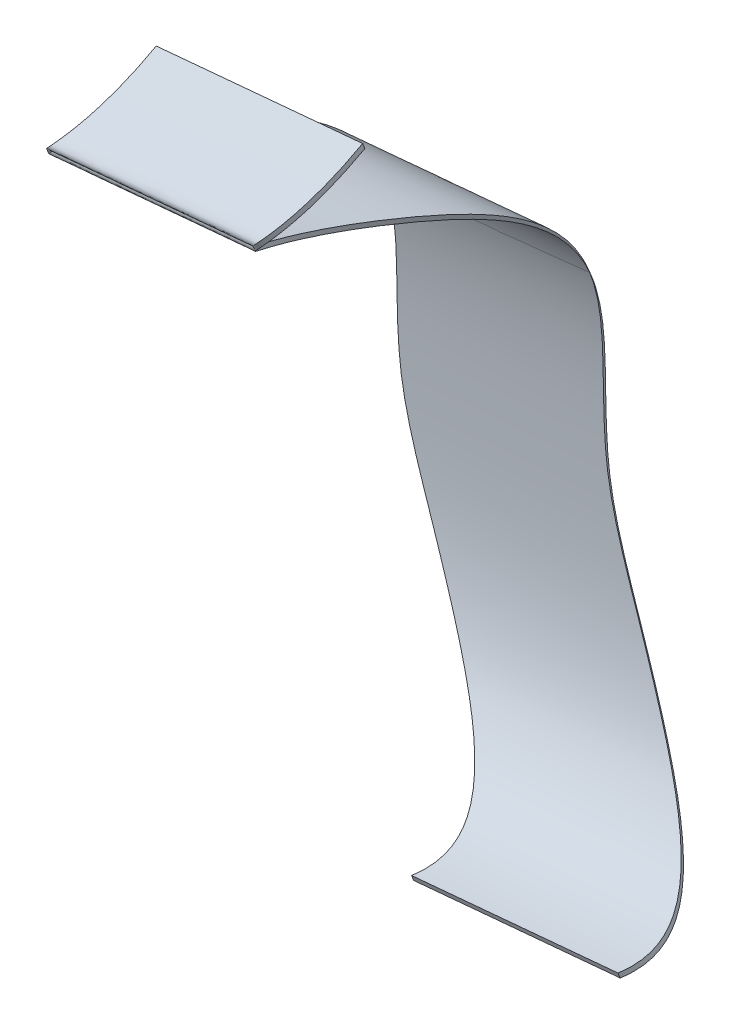
ISO-10303-21;
HEADER;
FILE_DESCRIPTION(('STEP AP214'),'2;1');
FILE_NAME('part.step','',(''),(''),'','','');
FILE_SCHEMA(('AUTOMOTIVE_DESIGN { 1 0 10303 214 1 1 1 1 }'));
ENDSEC;
DATA;
#1=APPLICATION_CONTEXT('core data for automotive mechanical design processes');
#2=APPLICATION_PROTOCOL_DEFINITION('international standard','automotive_design',2000,#1);
#3=PRODUCT_CONTEXT('',#1,'mechanical');
#4=PRODUCT('Part','Part','',(#3));
#5=PRODUCT_RELATED_PRODUCT_CATEGORY('part','',(#4));
#6=PRODUCT_DEFINITION_FORMATION('','',#4);
#7=PRODUCT_DEFINITION_CONTEXT('part definition',#1,'design');
#8=PRODUCT_DEFINITION('design','',#6,#7);
#9=PRODUCT_DEFINITION_SHAPE('','',#8);
#10=(LENGTH_UNIT() NAMED_UNIT(*) SI_UNIT(.MILLI.,.METRE.));
#11=(NAMED_UNIT(*) PLANE_ANGLE_UNIT() SI_UNIT($,.RADIAN.));
#12=(NAMED_UNIT(*) SI_UNIT($,.STERADIAN.) SOLID_ANGLE_UNIT());
#13=UNCERTAINTY_MEASURE_WITH_UNIT(LENGTH_MEASURE(1.E-05),#10,'distance_accuracy_value','');
#14=(GEOMETRIC_REPRESENTATION_CONTEXT(3) GLOBAL_UNCERTAINTY_ASSIGNED_CONTEXT((#13)) GLOBAL_UNIT_ASSIGNED_CONTEXT((#10,
#11,#12)) REPRESENTATION_CONTEXT('',''));
#15=CARTESIAN_POINT('',(0.,0.,0.));
#16=DIRECTION('',(0.,0.,1.));
#17=DIRECTION('',(1.,0.,0.));
#18=AXIS2_PLACEMENT_3D('',#15,#16,#17);
#19=CARTESIAN_POINT('',(0.694134087839004,-3.45576421709549,8.19127936923621));
#20=DIRECTION('',(-0.0778398423535431,0.38752763562898,-0.918565887983104));
#21=DIRECTION('',(0.,0.921361412279013,0.38870702072798));
#22=AXIS2_PLACEMENT_3D('',#19,#20,#21);
#23=PLANE('',#22);
#24=DIRECTION('',(-0.00842247206645635,-0.921584146093297,-0.388087262911035));
#25=VECTOR('',#24,1.);
#26=CARTESIAN_POINT('',(-15.9733367733512,-2.04938041013008,10.1970210583957));
#27=LINE('',#26,#25);
#28=CARTESIAN_POINT('',(-15.9733367733512,-2.04938041013008,10.1970210583957));
#29=VERTEX_POINT('',#28);
#30=CARTESIAN_POINT('',(-15.9775480093844,-2.51017248317673,10.0029774269402));
#31=VERTEX_POINT('',#30);
#32=EDGE_CURVE('E75',#29,#31,#27,.T.);
#33=ORIENTED_EDGE('',*,*,#32,.F.);
#34=DIRECTION('',(-0.996930298920976,-0.0224720558316756,0.0749999053334918));
#35=VECTOR('',#34,1.);
#36=CARTESIAN_POINT('',(-0.0224519906155823,-1.68982751682327,8.99702257305982));
#37=LINE('',#36,#35);
#38=CARTESIAN_POINT('',(-0.0224519906155824,-1.68982751682327,8.99702257305982));
#39=VERTEX_POINT('',#38);
#40=EDGE_CURVE('E78',#39,#29,#37,.T.);
#41=ORIENTED_EDGE('',*,*,#40,.F.);
#42=DIRECTION('',(0.00842247206645636,0.921584146093297,0.388087262911036));
#43=VECTOR('',#42,1.);
#44=CARTESIAN_POINT('',(-0.0224519906155823,-1.68982751682327,8.99702257305982));
#45=LINE('',#44,#43);
#46=CARTESIAN_POINT('',(-0.0266632266488106,-2.15061958986992,8.8029789416043));
#47=VERTEX_POINT('',#46);
#48=EDGE_CURVE('E97',#47,#39,#45,.T.);
#49=ORIENTED_EDGE('',*,*,#48,.F.);
#50=DIRECTION('',(0.996930298920976,0.0224720558316756,-0.0749999053334918));
#51=VECTOR('',#50,1.);
#52=CARTESIAN_POINT('',(-0.0266632266488105,-2.15061958986992,8.8029789416043));
#53=LINE('',#52,#51);
#54=EDGE_CURVE('E72',#31,#47,#53,.T.);
#55=ORIENTED_EDGE('',*,*,#54,.F.);
#56=EDGE_LOOP('',(#33,#41,#49,#55));
#57=FACE_BOUND('',#56,.T.);
#58=ADVANCED_FACE('F33',(#57),#23,.T.);
#59=CARTESIAN_POINT('',(17.5075699006048,-56.9275372601165,3.79662673866106));
#60=DIRECTION('',(-0.0778398423535431,0.38752763562898,-0.918565887983104));
#61=DIRECTION('',(0.,0.921361412279013,0.38870702072798));
#62=AXIS2_PLACEMENT_3D('',#59,#60,#61);
#63=PLANE('',#62);
#64=DIRECTION('',(-0.00842247206645635,-0.921584146093297,-0.388087262911035));
#65=VECTOR('',#64,1.);
#66=CARTESIAN_POINT('',(0.840099039414597,-55.5211534531511,5.80236842782053));
#67=LINE('',#66,#65);
#68=CARTESIAN_POINT('',(0.840099039414594,-55.5211534531511,5.80236842782053));
#69=VERTEX_POINT('',#68);
#70=CARTESIAN_POINT('',(0.835887803381366,-55.9819455261977,5.60832479636502));
#71=VERTEX_POINT('',#70);
#72=EDGE_CURVE('E103',#69,#71,#67,.T.);
#73=ORIENTED_EDGE('',*,*,#72,.T.);
#74=DIRECTION('',(0.996930298920976,0.0224720558316756,-0.0749999053334918));
#75=VECTOR('',#74,1.);
#76=CARTESIAN_POINT('',(16.786772586117,-55.6223926328909,4.40832631102915));
#77=LINE('',#76,#75);
#78=CARTESIAN_POINT('',(16.786772586117,-55.6223926328909,4.40832631102915));
#79=VERTEX_POINT('',#78);
#80=EDGE_CURVE('E154',#71,#79,#77,.T.);
#81=ORIENTED_EDGE('',*,*,#80,.T.);
#82=DIRECTION('',(0.00842247206645636,0.921584146093297,0.388087262911036));
#83=VECTOR('',#82,1.);
#84=CARTESIAN_POINT('',(16.7909838221502,-55.1616005598443,4.60236994248466));
#85=LINE('',#84,#83);
#86=CARTESIAN_POINT('',(16.7909838221502,-55.1616005598443,4.60236994248466));
#87=VERTEX_POINT('',#86);
#88=EDGE_CURVE('E52',#79,#87,#85,.T.);
#89=ORIENTED_EDGE('',*,*,#88,.T.);
#90=DIRECTION('',(-0.996930298920976,-0.0224720558316756,0.0749999053334918));
#91=VECTOR('',#90,1.);
#92=CARTESIAN_POINT('',(16.7909838221502,-55.1616005598443,4.60236994248466));
#93=LINE('',#92,#91);
#94=EDGE_CURVE('E11',#87,#69,#93,.T.);
#95=ORIENTED_EDGE('',*,*,#94,.T.);
#96=EDGE_LOOP('',(#73,#81,#89,#95));
#97=FACE_BOUND('',#96,.T.);
#98=ADVANCED_FACE('F126',(#97),#63,.F.);
#99=CARTESIAN_POINT('',(-15.9733367733512,-2.04938041013008,10.1970210583957));
#100=CARTESIAN_POINT('',(-15.1192219981271,-6.30161259063254,20.276187217447));
#101=CARTESIAN_POINT('',(-20.1649470523369,-6.92528177559341,19.9829178013689));
#102=CARTESIAN_POINT('',(-16.5316242354624,-8.18337628153389,9.93330620337625));
#103=CARTESIAN_POINT('',(-15.9734115478736,-8.32174293077195,8.65972725183365));
#104=CARTESIAN_POINT('',(-14.7028861645941,-8.6880752605404,5.98862533155526));
#105=CARTESIAN_POINT('',(-14.0121069979085,-8.92385707903027,4.6098611696778));
#106=CARTESIAN_POINT('',(-12.8405478596772,-9.65339597146761,2.10058553982618));
#107=CARTESIAN_POINT('',(-12.3877856280425,-10.1618059560594,0.997522552240376));
#108=CARTESIAN_POINT('',(-11.7459671900513,-11.4495442624897,-0.887560906080276));
#109=CARTESIAN_POINT('',(-11.5467839210668,-12.2235764041027,-1.67950258705669));
#110=CARTESIAN_POINT('',(-10.9833824225933,-16.614586398796,-5.0083103027006));
#111=CARTESIAN_POINT('',(-11.9167315668137,-21.7941240665439,-5.65245191673284));
#112=CARTESIAN_POINT('',(-11.9960095266997,-28.272686740068,-5.88725608607583));
#113=CARTESIAN_POINT('',(-11.9574958592766,-29.5686064753723,-5.9056977031329));
#114=CARTESIAN_POINT('',(-11.7012856202116,-32.1088775395578,-5.93437738985797));
#115=CARTESIAN_POINT('',(-11.4746930684367,-33.3519348767374,-5.94900027550442));
#116=CARTESIAN_POINT('',(-10.5936591666701,-36.950976128928,-5.96845271069978));
#117=CARTESIAN_POINT('',(-9.76065224020798,-39.1693562689896,-5.93926956806487));
#118=CARTESIAN_POINT('',(-7.28188268138242,-45.0004360328913,-5.50524809568978));
#119=CARTESIAN_POINT('',(-5.50379018241412,-47.8783063240084,-4.812723615862));
#120=CARTESIAN_POINT('',(-0.735946739938348,-54.2254451828077,-1.73595550788523));
#121=CARTESIAN_POINT('',(1.68734613603954,-55.4082276789055,1.64749204625911));
#122=CARTESIAN_POINT('',(0.840099039414597,-55.5211534531511,5.80236842782053));
#123=CARTESIAN_POINT('',(-15.9747405186956,-2.2029777678123,10.1323398479105));
#124=CARTESIAN_POINT('',(-15.1206257434715,-6.45520994831476,20.2115060069618));
#125=CARTESIAN_POINT('',(-20.1663507976813,-7.07887913327563,19.9182365908838));
#126=CARTESIAN_POINT('',(-16.5330279808068,-8.33697363921611,9.86862499289108));
#127=CARTESIAN_POINT('',(-15.974815293218,-8.47534028845546,8.59504604134848));
#128=CARTESIAN_POINT('',(-14.7042899099385,-8.84167261822133,5.92394412107008));
#129=CARTESIAN_POINT('',(-14.0135107432529,-9.07745443671373,4.54517995919263));
#130=CARTESIAN_POINT('',(-12.8419516050217,-9.80699332914859,2.03590432934101));
#131=CARTESIAN_POINT('',(-12.3891893733869,-10.3154033137417,0.932841341755202));
#132=CARTESIAN_POINT('',(-11.7473709353957,-11.6031416201719,-0.952242116565449));
#133=CARTESIAN_POINT('',(-11.5481876664112,-12.3771737617849,-1.74418379754186));
#134=CARTESIAN_POINT('',(-10.9847861679377,-16.7681837564782,-5.07299151318577));
#135=CARTESIAN_POINT('',(-11.9181353121581,-21.9477214242261,-5.71713312721801));
#136=CARTESIAN_POINT('',(-11.9974132720441,-28.4262840977503,-5.951937296561));
#137=CARTESIAN_POINT('',(-11.958899604621,-29.7222038330545,-5.97037891361808));
#138=CARTESIAN_POINT('',(-11.702689365556,-32.26247489724,-5.99905860034314));
#139=CARTESIAN_POINT('',(-11.4760968137811,-33.5055322344154,-6.0136814859896));
#140=CARTESIAN_POINT('',(-10.5950629120145,-37.1045734866188,-6.03313392118496));
#141=CARTESIAN_POINT('',(-9.76205598555239,-39.3229536266718,-6.00395077855004));
#142=CARTESIAN_POINT('',(-7.28328642672682,-45.1540333905735,-5.56992930617496));
#143=CARTESIAN_POINT('',(-5.50519392775852,-48.0319036816808,-4.87740482634718));
#144=CARTESIAN_POINT('',(-0.737350485282757,-54.3790425405096,-1.8006367183704));
#145=CARTESIAN_POINT('',(1.68594239069521,-55.5618250365877,1.58281083577355));
#146=CARTESIAN_POINT('',(0.838695294070189,-55.6747508108333,5.73768721733536));
#147=CARTESIAN_POINT('',(-15.97614426404,-2.35657512549451,10.0676586374253));
#148=CARTESIAN_POINT('',(-15.1220294888158,-6.60880730599735,20.1468247964775));
#149=CARTESIAN_POINT('',(-20.1677545430423,-7.23247649095784,19.8535553803986));
#150=CARTESIAN_POINT('',(-16.5344317261492,-8.49057099689833,9.80394378240591));
#151=CARTESIAN_POINT('',(-15.9762190385624,-8.62893764613639,8.53036483086331));
#152=CARTESIAN_POINT('',(-14.7056936552829,-8.99526997590483,5.85926291058491));
#153=CARTESIAN_POINT('',(-14.0149144885974,-9.2310517943947,4.48049874870746));
#154=CARTESIAN_POINT('',(-12.8433553503661,-9.96059068683205,1.97122311885584));
#155=CARTESIAN_POINT('',(-12.3905931187313,-10.4690006714239,0.868160131270031));
#156=CARTESIAN_POINT('',(-11.7487746807401,-11.7567389778541,-1.01692332705062));
#157=CARTESIAN_POINT('',(-11.5495914117556,-12.5307711194671,-1.80886500802703));
#158=CARTESIAN_POINT('',(-10.9861899132821,-16.9217811141604,-5.13767272367094));
#159=CARTESIAN_POINT('',(-11.9195390575025,-22.1013187819084,-5.78181433770318));
#160=CARTESIAN_POINT('',(-11.9988170173885,-28.5798814554325,-6.01661850704618));
#161=CARTESIAN_POINT('',(-11.9603033499655,-29.8758011907367,-6.03506012410325));
#162=CARTESIAN_POINT('',(-11.7040931109004,-32.4160722549222,-6.06373981082831));
#163=CARTESIAN_POINT('',(-11.4775005591256,-33.6591295921019,-6.07836269647477));
#164=CARTESIAN_POINT('',(-10.5964666573589,-37.2581708442924,-6.09781513167013));
#165=CARTESIAN_POINT('',(-9.7634597308968,-39.476550984354,-6.06863198903521));
#166=CARTESIAN_POINT('',(-7.28469017207124,-45.3076307482557,-5.63461051666013));
#167=CARTESIAN_POINT('',(-5.50659767310294,-48.1855010393728,-4.94208603683235));
#168=CARTESIAN_POINT('',(-0.738754230627168,-54.5326398981721,-1.86531792885557));
#169=CARTESIAN_POINT('',(1.68453864535072,-55.7154223942699,1.51812962528877));
#170=CARTESIAN_POINT('',(0.837291548725777,-55.8283481685155,5.67300600685019));
#171=CARTESIAN_POINT('',(-15.9775480093844,-2.51017248317673,10.0029774269402));
#172=CARTESIAN_POINT('',(-15.1234332341602,-6.76240466367956,20.0821435859923));
#173=CARTESIAN_POINT('',(-20.1691582883867,-7.38607384864005,19.7888741699134));
#174=CARTESIAN_POINT('',(-16.5358354714936,-8.64416835458054,9.73926257192073));
#175=CARTESIAN_POINT('',(-15.9776227839068,-8.7825350038186,8.46568362037813));
#176=CARTESIAN_POINT('',(-14.7070974006273,-9.14886733358705,5.79458170009974));
#177=CARTESIAN_POINT('',(-14.0163182339418,-9.38464915207692,4.41581753822229));
#178=CARTESIAN_POINT('',(-12.8447590957105,-10.1141880445143,1.90654190837067));
#179=CARTESIAN_POINT('',(-12.3919968640758,-10.6225980291061,0.803478920784858));
#180=CARTESIAN_POINT('',(-11.7501784260845,-11.9103363355364,-1.08160453753579));
#181=CARTESIAN_POINT('',(-11.5509951571,-12.6843684771493,-1.87354621851221));
#182=CARTESIAN_POINT('',(-10.9875936586265,-17.0753784718427,-5.20235393415612));
#183=CARTESIAN_POINT('',(-11.9209428028469,-22.2549161395906,-5.84649554818835));
#184=CARTESIAN_POINT('',(-12.000220762733,-28.7334788131147,-6.08129971753135));
#185=CARTESIAN_POINT('',(-11.9617070953099,-30.0293985484167,-6.09974133458842));
#186=CARTESIAN_POINT('',(-11.7054968562448,-32.5696696126067,-6.12842102131349));
#187=CARTESIAN_POINT('',(-11.47890430447,-33.8127269497841,-6.14304390695994));
#188=CARTESIAN_POINT('',(-10.5978704027033,-37.4117682019746,-6.1624963421553));
#189=CARTESIAN_POINT('',(-9.76486347624121,-39.6301483420362,-6.13331319952038));
#190=CARTESIAN_POINT('',(-7.28609391741564,-45.4612281059379,-5.6992917271453));
#191=CARTESIAN_POINT('',(-5.50800141844734,-48.3390983970551,-5.00676724731752));
#192=CARTESIAN_POINT('',(-0.740157975971577,-54.6862372558543,-1.92999913934075));
#193=CARTESIAN_POINT('',(1.68313490000632,-55.8690197519521,1.45344841480359));
#194=CARTESIAN_POINT('',(0.835887803381369,-55.9819455261977,5.60832479636502));
#195=B_SPLINE_SURFACE_WITH_KNOTS('',3,3,((#99,#100,#101,#102,#103,#104,#105,#106,#107,#108,#109,
#110,#111,#112,#113,#114,#115,#116,#117,#118,#119,#120,#121,#122),(#123,#124,#125,#126,#127,
#128,#129,#130,#131,#132,#133,#134,#135,#136,#137,#138,#139,#140,#141,#142,#143,#144,#145,#146),
(#147,#148,#149,#150,#151,#152,#153,#154,#155,#156,#157,#158,#159,#160,#161,#162,#163,#164,#165,
#166,#167,#168,#169,#170),(#171,#172,#173,#174,#175,#176,#177,#178,#179,#180,#181,#182,#183,
#184,#185,#186,#187,#188,#189,#190,#191,#192,#193,#194)),.UNSPECIFIED.,.F.,.F.,.F.,(4,4),(4,2,2,
2,2,2,2,2,2,2,2,4),(0.,1.),(0.,0.25,0.28125,0.3125,0.34375,0.375,0.5,0.53125,0.5625,0.625,0.75,
1.),.UNSPECIFIED.);
#196=CARTESIAN_POINT('',(-15.9775480093844,-2.51017248317673,10.0029774269402));
#197=CARTESIAN_POINT('',(-15.1234332341602,-6.76240466367956,20.0821435859923));
#198=CARTESIAN_POINT('',(-20.1691582883867,-7.38607384864005,19.7888741699134));
#199=CARTESIAN_POINT('',(-16.5358354714936,-8.64416835458054,9.73926257192073));
#200=CARTESIAN_POINT('',(-15.9776227839068,-8.7825350038186,8.46568362037813));
#201=CARTESIAN_POINT('',(-14.7070974006273,-9.14886733358705,5.79458170009974));
#202=CARTESIAN_POINT('',(-14.0163182339418,-9.38464915207692,4.41581753822229));
#203=CARTESIAN_POINT('',(-12.8447590957105,-10.1141880445143,1.90654190837067));
#204=CARTESIAN_POINT('',(-12.3919968640758,-10.6225980291061,0.803478920784858));
#205=CARTESIAN_POINT('',(-11.7501784260845,-11.9103363355364,-1.08160453753579));
#206=CARTESIAN_POINT('',(-11.5509951571,-12.6843684771493,-1.87354621851221));
#207=CARTESIAN_POINT('',(-10.9875936586265,-17.0753784718427,-5.20235393415612));
#208=CARTESIAN_POINT('',(-11.9209428028469,-22.2549161395906,-5.84649554818835));
#209=CARTESIAN_POINT('',(-12.000220762733,-28.7334788131147,-6.08129971753135));
#210=CARTESIAN_POINT('',(-11.9617070953099,-30.0293985484167,-6.09974133458842));
#211=CARTESIAN_POINT('',(-11.7054968562448,-32.5696696126067,-6.12842102131349));
#212=CARTESIAN_POINT('',(-11.47890430447,-33.8127269497841,-6.14304390695994));
#213=CARTESIAN_POINT('',(-10.5978704027033,-37.4117682019746,-6.1624963421553));
#214=CARTESIAN_POINT('',(-9.76486347624121,-39.6301483420362,-6.13331319952038));
#215=CARTESIAN_POINT('',(-7.28609391741564,-45.4612281059379,-5.6992917271453));
#216=CARTESIAN_POINT('',(-5.50800141844734,-48.3390983970551,-5.00676724731752));
#217=CARTESIAN_POINT('',(-0.740157975971577,-54.6862372558543,-1.92999913934075));
#218=CARTESIAN_POINT('',(1.68313490000632,-55.8690197519521,1.45344841480359));
#219=CARTESIAN_POINT('',(0.835887803381369,-55.9819455261977,5.60832479636502));
#220=B_SPLINE_CURVE_WITH_KNOTS('',3,(#196,#197,#198,#199,#200,#201,#202,#203,#204,#205,#206,
#207,#208,#209,#210,#211,#212,#213,#214,#215,#216,#217,#218,#219),.UNSPECIFIED.,.F.,.F.,(4,2,2,
2,2,2,2,2,2,2,2,4),(0.,0.25,0.28125,0.3125,0.34375,0.375,0.5,0.53125,0.5625,0.625,0.75,1.),.UNSPECIFIED.);
#221=EDGE_CURVE('E150',#31,#71,#220,.T.);
#222=CARTESIAN_POINT('',(-15.9733367733512,-2.04938041013008,10.1970210583957));
#223=CARTESIAN_POINT('',(-15.1192219981271,-6.30161259063254,20.276187217447));
#224=CARTESIAN_POINT('',(-20.1649470523369,-6.92528177559341,19.9829178013689));
#225=CARTESIAN_POINT('',(-16.5316242354624,-8.18337628153389,9.93330620337625));
#226=CARTESIAN_POINT('',(-15.9734115478736,-8.32174293077195,8.65972725183365));
#227=CARTESIAN_POINT('',(-14.7028861645941,-8.6880752605404,5.98862533155526));
#228=CARTESIAN_POINT('',(-14.0121069979085,-8.92385707903027,4.6098611696778));
#229=CARTESIAN_POINT('',(-12.8405478596772,-9.65339597146761,2.10058553982618));
#230=CARTESIAN_POINT('',(-12.3877856280425,-10.1618059560594,0.997522552240376));
#231=CARTESIAN_POINT('',(-11.7459671900513,-11.4495442624897,-0.887560906080276));
#232=CARTESIAN_POINT('',(-11.5467839210668,-12.2235764041027,-1.67950258705669));
#233=CARTESIAN_POINT('',(-10.9833824225933,-16.614586398796,-5.0083103027006));
#234=CARTESIAN_POINT('',(-11.9167315668137,-21.7941240665439,-5.65245191673284));
#235=CARTESIAN_POINT('',(-11.9960095266997,-28.272686740068,-5.88725608607583));
#236=CARTESIAN_POINT('',(-11.9574958592766,-29.5686064753723,-5.9056977031329));
#237=CARTESIAN_POINT('',(-11.7012856202116,-32.1088775395578,-5.93437738985797));
#238=CARTESIAN_POINT('',(-11.4746930684367,-33.3519348767374,-5.94900027550442));
#239=CARTESIAN_POINT('',(-10.5936591666701,-36.950976128928,-5.96845271069978));
#240=CARTESIAN_POINT('',(-9.76065224020798,-39.1693562689896,-5.93926956806487));
#241=CARTESIAN_POINT('',(-7.28188268138242,-45.0004360328913,-5.50524809568978));
#242=CARTESIAN_POINT('',(-5.50379018241412,-47.8783063240084,-4.812723615862));
#243=CARTESIAN_POINT('',(-0.735946739938348,-54.2254451828077,-1.73595550788523));
#244=CARTESIAN_POINT('',(1.68734613603954,-55.4082276789055,1.64749204625911));
#245=CARTESIAN_POINT('',(0.840099039414597,-55.5211534531511,5.80236842782053));
#246=B_SPLINE_CURVE_WITH_KNOTS('',3,(#222,#223,#224,#225,#226,#227,#228,#229,#230,#231,#232,
#233,#234,#235,#236,#237,#238,#239,#240,#241,#242,#243,#244,#245),.UNSPECIFIED.,.F.,.F.,(4,2,2,
2,2,2,2,2,2,2,2,4),(0.,0.25,0.28125,0.3125,0.34375,0.375,0.5,0.53125,0.5625,0.625,0.75,1.),.UNSPECIFIED.);
#247=EDGE_CURVE('E37',#29,#69,#246,.T.);
#248=ORIENTED_EDGE('',*,*,#221,.T.);
#249=ORIENTED_EDGE('',*,*,#72,.F.);
#250=ORIENTED_EDGE('',*,*,#247,.F.);
#251=ORIENTED_EDGE('',*,*,#32,.T.);
#252=EDGE_LOOP('',(#248,#249,#250,#251));
#253=FACE_BOUND('',#252,.T.);
#254=ADVANCED_FACE('F102',(#253),#195,.T.);
#255=CARTESIAN_POINT('',(-15.9775480093844,-2.51017248317673,10.0029774269402));
#256=CARTESIAN_POINT('',(-15.1234332341603,-6.76240466367919,20.0821435859914));
#257=CARTESIAN_POINT('',(-20.1691582883701,-7.38607384864005,19.7888741699134));
#258=CARTESIAN_POINT('',(-16.5358354714957,-8.64416835458054,9.73926257192073));
#259=CARTESIAN_POINT('',(-15.9776227839068,-8.7825350038186,8.46568362037813));
#260=CARTESIAN_POINT('',(-14.7070974006273,-9.14886733358705,5.79458170009974));
#261=CARTESIAN_POINT('',(-14.0163182339418,-9.38464915207692,4.41581753822229));
#262=CARTESIAN_POINT('',(-12.8447590957105,-10.1141880445143,1.90654190837067));
#263=CARTESIAN_POINT('',(-12.3919968640758,-10.6225980291061,0.803478920784858));
#264=CARTESIAN_POINT('',(-11.7501784260845,-11.9103363355364,-1.08160453753579));
#265=CARTESIAN_POINT('',(-11.5509951571,-12.6843684771493,-1.87354621851221));
#266=CARTESIAN_POINT('',(-10.9875936586265,-17.0753784718427,-5.20235393415612));
#267=CARTESIAN_POINT('',(-11.9209428028469,-22.2549161395906,-5.84649554818835));
#268=CARTESIAN_POINT('',(-12.000220762733,-28.7334788131147,-6.08129971753135));
#269=CARTESIAN_POINT('',(-11.9617070953099,-30.0293985484167,-6.09974133458842));
#270=CARTESIAN_POINT('',(-11.7054968562448,-32.5696696126067,-6.12842102131349));
#271=CARTESIAN_POINT('',(-11.47890430447,-33.8127269497841,-6.14304390695994));
#272=CARTESIAN_POINT('',(-10.5978704027033,-37.4117682019746,-6.1624963421553));
#273=CARTESIAN_POINT('',(-9.76486347624121,-39.6301483420362,-6.13331319952038));
#274=CARTESIAN_POINT('',(-7.28609391741565,-45.4612281059379,-5.6992917271453));
#275=CARTESIAN_POINT('',(-5.50800141844735,-48.3390983970551,-5.00676724731752));
#276=CARTESIAN_POINT('',(-0.74015797597158,-54.6862372558543,-1.92999913934075));
#277=CARTESIAN_POINT('',(1.68313490000631,-55.8690197519521,1.45344841480359));
#278=CARTESIAN_POINT('',(0.835887803381365,-55.9819455261977,5.60832479636502));
#279=CARTESIAN_POINT('',(-10.6605864151392,-2.39032151874112,9.60297793182822));
#280=CARTESIAN_POINT('',(-9.80647163991506,-6.64255369924377,19.6821440908799));
#281=CARTESIAN_POINT('',(-14.8521966941332,-7.26622288420445,19.3888746748014));
#282=CARTESIAN_POINT('',(-11.2188738772494,-8.52431739014494,9.33926307680878));
#283=CARTESIAN_POINT('',(-10.6606611896616,-8.662684039383,8.06568412526618));
#284=CARTESIAN_POINT('',(-9.39013580638214,-9.02901636915145,5.39458220498778));
#285=CARTESIAN_POINT('',(-8.69935663969657,-9.26479818764131,4.01581804311033));
#286=CARTESIAN_POINT('',(-7.52779750146528,-9.99433708007866,1.50654241325871));
#287=CARTESIAN_POINT('',(-7.07503526983107,-10.5027470646705,0.403479425672901));
#288=CARTESIAN_POINT('',(-6.4332168318388,-11.7904853711007,-1.48160403264775));
#289=CARTESIAN_POINT('',(-6.23403356285482,-12.5645175127137,-2.27354571362416));
#290=CARTESIAN_POINT('',(-5.6706320643813,-16.9555275074071,-5.60235342926807));
#291=CARTESIAN_POINT('',(-6.60398120860171,-22.135065175155,-6.24649504330031));
#292=CARTESIAN_POINT('',(-6.68325916848776,-28.6136278486791,-6.4812992126433));
#293=CARTESIAN_POINT('',(-6.64474550106466,-29.9095475839833,-6.49974082970038));
#294=CARTESIAN_POINT('',(-6.38853526199963,-32.4498186481689,-6.52842051642544));
#295=CARTESIAN_POINT('',(-6.16194271022477,-33.6928759853485,-6.5430434020719));
#296=CARTESIAN_POINT('',(-5.28090880845813,-37.291917237539,-6.56249583726726));
#297=CARTESIAN_POINT('',(-4.44790188199693,-39.5102973776006,-6.53331269463234));
#298=CARTESIAN_POINT('',(-1.96913232316861,-45.3413771415023,-6.09929122225726));
#299=CARTESIAN_POINT('',(-0.191039824202148,-48.2192474326195,-5.40676674242948));
#300=CARTESIAN_POINT('',(4.57680361827362,-54.5663862914187,-2.3299986344527));
#301=CARTESIAN_POINT('',(7.00009649425151,-55.7491687875165,1.05344891969163));
#302=CARTESIAN_POINT('',(6.15284939762657,-55.8620945617621,5.20832530125306));
#303=CARTESIAN_POINT('',(-5.34362482089402,-2.27047055430552,9.20297843671626));
#304=CARTESIAN_POINT('',(-4.48951004566986,-6.52270273480817,19.282144595768));
#305=CARTESIAN_POINT('',(-9.53523509988801,-7.14637191976885,18.9888751796895));
#306=CARTESIAN_POINT('',(-5.90191228300423,-8.40446642570934,8.93926358169682));
#307=CARTESIAN_POINT('',(-5.34369959541642,-8.5428330749474,7.66568463015422));
#308=CARTESIAN_POINT('',(-4.07317421213693,-8.90916540471585,4.99458270987583));
#309=CARTESIAN_POINT('',(-3.38239504545075,-9.14494722320571,3.61581854799837));
#310=CARTESIAN_POINT('',(-2.2108359072207,-9.87448611564306,1.10654291814675));
#311=CARTESIAN_POINT('',(-1.75807367558587,-10.3828961002349,0.00347993056094484));
#312=CARTESIAN_POINT('',(-1.1162552375936,-11.6706344066651,-1.88160352775971));
#313=CARTESIAN_POINT('',(-0.917071968609614,-12.4446665482781,-2.67354520873612));
#314=CARTESIAN_POINT('',(-0.353670470136096,-16.8356765429715,-6.00235292438003));
#315=CARTESIAN_POINT('',(-1.28701961435651,-22.0152142107194,-6.64649453841227));
#316=CARTESIAN_POINT('',(-1.36629757424256,-28.4937768842435,-6.88129870775526));
#317=CARTESIAN_POINT('',(-1.32778390681946,-29.7896966195477,-6.89974032481233));
#318=CARTESIAN_POINT('',(-1.07157366775443,-32.3299676837332,-6.9284200115374));
#319=CARTESIAN_POINT('',(-0.844981115979569,-33.5730250209129,-6.94304289718385));
#320=CARTESIAN_POINT('',(0.0360527857870715,-37.1720662731034,-6.96249533237921));
#321=CARTESIAN_POINT('',(0.869059712248272,-39.390446413165,-6.9333121897443));
#322=CARTESIAN_POINT('',(3.34782927107659,-45.2215261770667,-6.49929071736921));
#323=CARTESIAN_POINT('',(5.12592177004305,-48.0993964681838,-5.80676623754143));
#324=CARTESIAN_POINT('',(9.89376521251882,-54.4465353269831,-2.72999812956466));
#325=CARTESIAN_POINT('',(12.3170580884967,-55.6293178230809,0.653449424579679));
#326=CARTESIAN_POINT('',(11.4698109918718,-55.7422435973265,4.8083258061411));
#327=CARTESIAN_POINT('',(-0.0266632266488105,-2.15061958986992,8.8029789416043));
#328=CARTESIAN_POINT('',(0.82745154857535,-6.40285177037256,18.882145100656));
#329=CARTESIAN_POINT('',(-4.2182735056428,-7.02652095533325,18.5888756845775));
#330=CARTESIAN_POINT('',(-0.584950688759018,-8.28461546127373,8.53926408658486));
#331=CARTESIAN_POINT('',(-0.026738001171207,-8.42298211051179,7.26568513504226));
#332=CARTESIAN_POINT('',(1.24378738210827,-8.78931444028024,4.59458321476387));
#333=CARTESIAN_POINT('',(1.93456654879446,-9.02509625877011,3.21581905288642));
#334=CARTESIAN_POINT('',(3.10612568702451,-9.75463515120745,0.706543423034798));
#335=CARTESIAN_POINT('',(3.55888791865934,-10.2630451357993,-0.396519564551012));
#336=CARTESIAN_POINT('',(4.20070635665161,-11.5507834422295,-2.28160302287166));
#337=CARTESIAN_POINT('',(4.39988962563559,-12.3248155838425,-3.07354470384808));
#338=CARTESIAN_POINT('',(4.96329112410911,-16.7158255785359,-6.40235241949198));
#339=CARTESIAN_POINT('',(4.0299419798887,-21.8953632462838,-7.04649403352422));
#340=CARTESIAN_POINT('',(3.95066402000265,-28.3739259198079,-7.28129820286722));
#341=CARTESIAN_POINT('',(3.98917768742575,-29.6698456551121,-7.29973981992429));
#342=CARTESIAN_POINT('',(4.24538792649078,-32.2101167192976,-7.32841950664936));
#343=CARTESIAN_POINT('',(4.47198047826564,-33.4531740564773,-7.34304239229581));
#344=CARTESIAN_POINT('',(5.35301438003228,-37.0522153086678,-7.36249482749117));
#345=CARTESIAN_POINT('',(6.18602130649348,-39.2705954487294,-7.33331168485625));
#346=CARTESIAN_POINT('',(8.6647908653218,-45.1016752126311,-6.89929021248117));
#347=CARTESIAN_POINT('',(10.4428833642883,-47.9795455037482,-6.20676573265339));
#348=CARTESIAN_POINT('',(15.210726806764,-54.3266843625475,-3.12999762467662));
#349=CARTESIAN_POINT('',(17.6340196827419,-55.5094668586453,0.253449929467723));
#350=CARTESIAN_POINT('',(16.786772586117,-55.6223926328909,4.40832631102915));
#351=B_SPLINE_SURFACE_WITH_KNOTS('',3,3,((#255,#256,#257,#258,#259,#260,#261,#262,#263,#264,
#265,#266,#267,#268,#269,#270,#271,#272,#273,#274,#275,#276,#277,#278),(#279,#280,#281,#282,
#283,#284,#285,#286,#287,#288,#289,#290,#291,#292,#293,#294,#295,#296,#297,#298,#299,#300,#301,
#302),(#303,#304,#305,#306,#307,#308,#309,#310,#311,#312,#313,#314,#315,#316,#317,#318,#319,
#320,#321,#322,#323,#324,#325,#326),(#327,#328,#329,#330,#331,#332,#333,#334,#335,#336,#337,
#338,#339,#340,#341,#342,#343,#344,#345,#346,#347,#348,#349,#350)),.UNSPECIFIED.,.F.,.F.,.F.,(4,
4),(4,2,2,2,2,2,2,2,2,2,2,4),(0.,1.),(0.,0.25,0.28125,0.3125,0.34375,0.375,0.5,0.53125,0.5625,
0.625,0.75,1.),.UNSPECIFIED.);
#352=CARTESIAN_POINT('',(-0.0266632266488105,-2.15061958986992,8.8029789416043));
#353=CARTESIAN_POINT('',(0.82745154857535,-6.40285177037256,18.882145100656));
#354=CARTESIAN_POINT('',(-4.2182735056428,-7.02652095533325,18.5888756845775));
#355=CARTESIAN_POINT('',(-0.584950688759018,-8.28461546127373,8.53926408658486));
#356=CARTESIAN_POINT('',(-0.026738001171207,-8.42298211051179,7.26568513504226));
#357=CARTESIAN_POINT('',(1.24378738210827,-8.78931444028024,4.59458321476387));
#358=CARTESIAN_POINT('',(1.93456654879446,-9.02509625877011,3.21581905288642));
#359=CARTESIAN_POINT('',(3.10612568702451,-9.75463515120745,0.706543423034798));
#360=CARTESIAN_POINT('',(3.55888791865934,-10.2630451357993,-0.396519564551012));
#361=CARTESIAN_POINT('',(4.20070635665161,-11.5507834422295,-2.28160302287166));
#362=CARTESIAN_POINT('',(4.39988962563559,-12.3248155838425,-3.07354470384808));
#363=CARTESIAN_POINT('',(4.96329112410911,-16.7158255785359,-6.40235241949198));
#364=CARTESIAN_POINT('',(4.0299419798887,-21.8953632462838,-7.04649403352422));
#365=CARTESIAN_POINT('',(3.95066402000265,-28.3739259198079,-7.28129820286722));
#366=CARTESIAN_POINT('',(3.98917768742575,-29.6698456551121,-7.29973981992429));
#367=CARTESIAN_POINT('',(4.24538792649078,-32.2101167192976,-7.32841950664936));
#368=CARTESIAN_POINT('',(4.47198047826564,-33.4531740564773,-7.34304239229581));
#369=CARTESIAN_POINT('',(5.35301438003228,-37.0522153086678,-7.36249482749117));
#370=CARTESIAN_POINT('',(6.18602130649348,-39.2705954487294,-7.33331168485625));
#371=CARTESIAN_POINT('',(8.6647908653218,-45.1016752126311,-6.89929021248117));
#372=CARTESIAN_POINT('',(10.4428833642883,-47.9795455037482,-6.20676573265339));
#373=CARTESIAN_POINT('',(15.210726806764,-54.3266843625475,-3.12999762467662));
#374=CARTESIAN_POINT('',(17.6340196827419,-55.5094668586453,0.253449929467723));
#375=CARTESIAN_POINT('',(16.786772586117,-55.6223926328909,4.40832631102915));
#376=B_SPLINE_CURVE_WITH_KNOTS('',3,(#352,#353,#354,#355,#356,#357,#358,#359,#360,#361,#362,
#363,#364,#365,#366,#367,#368,#369,#370,#371,#372,#373,#374,#375),.UNSPECIFIED.,.F.,.F.,(4,2,2,
2,2,2,2,2,2,2,2,4),(0.,0.25,0.28125,0.3125,0.34375,0.375,0.5,0.53125,0.5625,0.625,0.75,1.),.UNSPECIFIED.);
#377=EDGE_CURVE('E156',#47,#79,#376,.T.);
#378=ORIENTED_EDGE('',*,*,#377,.T.);
#379=ORIENTED_EDGE('',*,*,#80,.F.);
#380=ORIENTED_EDGE('',*,*,#221,.F.);
#381=ORIENTED_EDGE('',*,*,#54,.T.);
#382=EDGE_LOOP('',(#378,#379,#380,#381));
#383=FACE_BOUND('',#382,.T.);
#384=ADVANCED_FACE('F125',(#383),#351,.T.);
#385=CARTESIAN_POINT('',(-0.0266632266488105,-2.15061958986992,8.8029789416043));
#386=CARTESIAN_POINT('',(0.82745154857535,-6.40285177037256,18.882145100656));
#387=CARTESIAN_POINT('',(-4.2182735056428,-7.02652095533325,18.5888756845775));
#388=CARTESIAN_POINT('',(-0.584950688759018,-8.28461546127373,8.53926408658486));
#389=CARTESIAN_POINT('',(-0.026738001171207,-8.42298211051179,7.26568513504226));
#390=CARTESIAN_POINT('',(1.24378738210827,-8.78931444028024,4.59458321476387));
#391=CARTESIAN_POINT('',(1.93456654879446,-9.02509625877011,3.21581905288642));
#392=CARTESIAN_POINT('',(3.10612568702451,-9.75463515120745,0.706543423034798));
#393=CARTESIAN_POINT('',(3.55888791865934,-10.2630451357993,-0.396519564551012));
#394=CARTESIAN_POINT('',(4.20070635665161,-11.5507834422295,-2.28160302287166));
#395=CARTESIAN_POINT('',(4.39988962563559,-12.3248155838425,-3.07354470384808));
#396=CARTESIAN_POINT('',(4.96329112410911,-16.7158255785359,-6.40235241949198));
#397=CARTESIAN_POINT('',(4.0299419798887,-21.8953632462838,-7.04649403352422));
#398=CARTESIAN_POINT('',(3.95066402000265,-28.3739259198079,-7.28129820286722));
#399=CARTESIAN_POINT('',(3.98917768742575,-29.6698456551121,-7.29973981992429));
#400=CARTESIAN_POINT('',(4.24538792649078,-32.2101167192976,-7.32841950664936));
#401=CARTESIAN_POINT('',(4.47198047826564,-33.4531740564773,-7.34304239229581));
#402=CARTESIAN_POINT('',(5.35301438003228,-37.0522153086678,-7.36249482749117));
#403=CARTESIAN_POINT('',(6.18602130649348,-39.2705954487294,-7.33331168485625));
#404=CARTESIAN_POINT('',(8.6647908653218,-45.1016752126311,-6.89929021248117));
#405=CARTESIAN_POINT('',(10.4428833642883,-47.9795455037482,-6.20676573265339));
#406=CARTESIAN_POINT('',(15.210726806764,-54.3266843625475,-3.12999762467662));
#407=CARTESIAN_POINT('',(17.6340196827419,-55.5094668586453,0.253449929467723));
#408=CARTESIAN_POINT('',(16.786772586117,-55.6223926328909,4.40832631102915));
#409=CARTESIAN_POINT('',(-0.0252594813044011,-1.9970222321877,8.86766015208948));
#410=CARTESIAN_POINT('',(0.82885529391976,-6.24925441269035,18.9468263111412));
#411=CARTESIAN_POINT('',(-4.21686976029839,-6.87292359765103,18.6535568950627));
#412=CARTESIAN_POINT('',(-0.583546943414608,-8.13101810359152,8.60394529707004));
#413=CARTESIAN_POINT('',(-0.0253342558267976,-8.26938475282958,7.33036634552744));
#414=CARTESIAN_POINT('',(1.24519112745268,-8.63571708259803,4.65926442524904));
#415=CARTESIAN_POINT('',(1.93597029413887,-8.87149890108789,3.28050026337159));
#416=CARTESIAN_POINT('',(3.10752943236892,-9.60103779352523,0.771224633519971));
#417=CARTESIAN_POINT('',(3.56029166400375,-10.1094477781171,-0.331838354065839));
#418=CARTESIAN_POINT('',(4.20211010199602,-11.3971860845473,-2.21692181238649));
#419=CARTESIAN_POINT('',(4.40129337098,-12.1712182261603,-3.0088634933629));
#420=CARTESIAN_POINT('',(4.96469486945352,-16.5622282208536,-6.33767120900681));
#421=CARTESIAN_POINT('',(4.03134572523311,-21.7417658886015,-6.98181282303905));
#422=CARTESIAN_POINT('',(3.95206776534706,-28.2203285621257,-7.21661699238204));
#423=CARTESIAN_POINT('',(3.99058143277016,-29.5162482974299,-7.23505860943912));
#424=CARTESIAN_POINT('',(4.24679167183519,-32.0565193616154,-7.26373829616418));
#425=CARTESIAN_POINT('',(4.47338422361005,-33.2995766987951,-7.27836118181064));
#426=CARTESIAN_POINT('',(5.35441812537669,-36.8986179509856,-7.297813617006));
#427=CARTESIAN_POINT('',(6.18742505183789,-39.1169980910472,-7.26863047437108));
#428=CARTESIAN_POINT('',(8.66619461066621,-44.9480778549489,-6.834609001996));
#429=CARTESIAN_POINT('',(10.4442871096327,-47.825948146066,-6.14208452216822));
#430=CARTESIAN_POINT('',(15.2121305521084,-54.1730870048653,-3.06531641419144));
#431=CARTESIAN_POINT('',(17.6354234280863,-55.3558695009631,0.318131139952896));
#432=CARTESIAN_POINT('',(16.7881763314614,-55.4687952752087,4.47300752151432));
#433=CARTESIAN_POINT('',(-0.0238557359599917,-1.84342487450549,8.93234136257465));
#434=CARTESIAN_POINT('',(0.830259039264169,-6.09565705500814,19.0115075216264));
#435=CARTESIAN_POINT('',(-4.21546601495398,-6.71932623996881,18.7182381055479));
#436=CARTESIAN_POINT('',(-0.582143198070199,-7.9774207459093,8.66862650755521));
#437=CARTESIAN_POINT('',(-0.0239305104823883,-8.11578739514736,7.39504755601261));
#438=CARTESIAN_POINT('',(1.24659487279709,-8.48211972491581,4.72394563573421));
#439=CARTESIAN_POINT('',(1.93737403948328,-8.71790154340568,3.34518147385676));
#440=CARTESIAN_POINT('',(3.10893317771333,-9.44744043584302,0.835905844005142));
#441=CARTESIAN_POINT('',(3.56169540934816,-9.95585042043485,-0.267157143580667));
#442=CARTESIAN_POINT('',(4.20351384734043,-11.2435887268651,-2.15224060190132));
#443=CARTESIAN_POINT('',(4.40269711632441,-12.0176208684781,-2.94418228287773));
#444=CARTESIAN_POINT('',(4.96609861479793,-16.4086308631714,-6.27298999852164));
#445=CARTESIAN_POINT('',(4.03274947057752,-21.5881685309193,-6.91713161255388));
#446=CARTESIAN_POINT('',(3.95347151069147,-28.0667312044435,-7.15193578189687));
#447=CARTESIAN_POINT('',(3.99198517811457,-29.3626509397477,-7.17037739895395));
#448=CARTESIAN_POINT('',(4.2481954171796,-31.9029220039332,-7.19905708567901));
#449=CARTESIAN_POINT('',(4.47478796895446,-33.1459793411128,-7.21367997132547));
#450=CARTESIAN_POINT('',(5.3558218707211,-36.7450205933034,-7.23313240652083));
#451=CARTESIAN_POINT('',(6.1888287971823,-38.963400733365,-7.20394926388591));
#452=CARTESIAN_POINT('',(8.66759835601062,-44.7944804972667,-6.76992779151083));
#453=CARTESIAN_POINT('',(10.4456908549771,-47.6723507883838,-6.07740331168305));
#454=CARTESIAN_POINT('',(15.2135342974528,-54.0194896471831,-3.00063520370627));
#455=CARTESIAN_POINT('',(17.6368271734307,-55.2022721432809,0.382812350438067));
#456=CARTESIAN_POINT('',(16.7895800768058,-55.3151979175265,4.53768873199949));
#457=CARTESIAN_POINT('',(-0.0224519906155823,-1.68982751682327,8.99702257305982));
#458=CARTESIAN_POINT('',(0.831662784608578,-5.94205969732591,19.0761887321115));
#459=CARTESIAN_POINT('',(-4.21406226960958,-6.5657288822866,18.7829193160331));
#460=CARTESIAN_POINT('',(-0.58073945272579,-7.82382338822709,8.73330771804038));
#461=CARTESIAN_POINT('',(-0.0225267651379788,-7.96219003746514,7.45972876649778));
#462=CARTESIAN_POINT('',(1.2479986181415,-8.32852236723359,4.78862684621939));
#463=CARTESIAN_POINT('',(1.93877778482769,-8.56430418572346,3.40986268434193));
#464=CARTESIAN_POINT('',(3.11033692305774,-9.2938430781608,0.900587054490316));
#465=CARTESIAN_POINT('',(3.56309915469256,-9.80225306275263,-0.202475933095494));
#466=CARTESIAN_POINT('',(4.20491759268484,-11.0899913691829,-2.08755939141615));
#467=CARTESIAN_POINT('',(4.40410086166882,-11.8640235107959,-2.87950107239256));
#468=CARTESIAN_POINT('',(4.96750236014234,-16.2550335054892,-6.20830878803647));
#469=CARTESIAN_POINT('',(4.03415321592193,-21.4345711732371,-6.85245040206871));
#470=CARTESIAN_POINT('',(3.95487525603588,-27.9131338467612,-7.0872545714117));
#471=CARTESIAN_POINT('',(3.99338892345898,-29.2090535820655,-7.10569618846877));
#472=CARTESIAN_POINT('',(4.24959916252401,-31.749324646251,-7.13437587519384));
#473=CARTESIAN_POINT('',(4.47619171429887,-32.9923819834306,-7.14899876084029));
#474=CARTESIAN_POINT('',(5.35722561606551,-36.5914232356212,-7.16845119603565));
#475=CARTESIAN_POINT('',(6.19023254252671,-38.8098033756828,-7.13926805340073));
#476=CARTESIAN_POINT('',(8.66900210135503,-44.6408831395845,-6.70524658102565));
#477=CARTESIAN_POINT('',(10.4470946003215,-47.5187534307016,-6.01272210119787));
#478=CARTESIAN_POINT('',(15.2149380427973,-53.8658922895009,-2.9359539932211));
#479=CARTESIAN_POINT('',(17.6382309187752,-55.0486747855987,0.44749356092324));
#480=CARTESIAN_POINT('',(16.7909838221502,-55.1616005598443,4.60236994248466));
#481=B_SPLINE_SURFACE_WITH_KNOTS('',3,3,((#385,#386,#387,#388,#389,#390,#391,#392,#393,#394,
#395,#396,#397,#398,#399,#400,#401,#402,#403,#404,#405,#406,#407,#408),(#409,#410,#411,#412,
#413,#414,#415,#416,#417,#418,#419,#420,#421,#422,#423,#424,#425,#426,#427,#428,#429,#430,#431,
#432),(#433,#434,#435,#436,#437,#438,#439,#440,#441,#442,#443,#444,#445,#446,#447,#448,#449,
#450,#451,#452,#453,#454,#455,#456),(#457,#458,#459,#460,#461,#462,#463,#464,#465,#466,#467,
#468,#469,#470,#471,#472,#473,#474,#475,#476,#477,#478,#479,#480)),.UNSPECIFIED.,.F.,.F.,.F.,(4,
4),(4,2,2,2,2,2,2,2,2,2,2,4),(0.,1.),(0.,0.25,0.28125,0.3125,0.34375,0.375,0.5,0.53125,0.5625,
0.625,0.75,1.),.UNSPECIFIED.);
#482=CARTESIAN_POINT('',(-0.0224519906155823,-1.68982751682327,8.99702257305982));
#483=CARTESIAN_POINT('',(0.831662784608578,-5.94205969732591,19.0761887321115));
#484=CARTESIAN_POINT('',(-4.21406226960958,-6.5657288822866,18.7829193160331));
#485=CARTESIAN_POINT('',(-0.58073945272579,-7.82382338822709,8.73330771804038));
#486=CARTESIAN_POINT('',(-0.0225267651379788,-7.96219003746514,7.45972876649778));
#487=CARTESIAN_POINT('',(1.2479986181415,-8.32852236723359,4.78862684621939));
#488=CARTESIAN_POINT('',(1.93877778482769,-8.56430418572346,3.40986268434193));
#489=CARTESIAN_POINT('',(3.11033692305774,-9.2938430781608,0.900587054490316));
#490=CARTESIAN_POINT('',(3.56309915469256,-9.80225306275263,-0.202475933095494));
#491=CARTESIAN_POINT('',(4.20491759268484,-11.0899913691829,-2.08755939141615));
#492=CARTESIAN_POINT('',(4.40410086166882,-11.8640235107959,-2.87950107239256));
#493=CARTESIAN_POINT('',(4.96750236014234,-16.2550335054892,-6.20830878803647));
#494=CARTESIAN_POINT('',(4.03415321592193,-21.4345711732371,-6.85245040206871));
#495=CARTESIAN_POINT('',(3.95487525603588,-27.9131338467612,-7.0872545714117));
#496=CARTESIAN_POINT('',(3.99338892345898,-29.2090535820655,-7.10569618846877));
#497=CARTESIAN_POINT('',(4.24959916252401,-31.749324646251,-7.13437587519384));
#498=CARTESIAN_POINT('',(4.47619171429887,-32.9923819834306,-7.14899876084029));
#499=CARTESIAN_POINT('',(5.35722561606551,-36.5914232356212,-7.16845119603565));
#500=CARTESIAN_POINT('',(6.19023254252671,-38.8098033756828,-7.13926805340073));
#501=CARTESIAN_POINT('',(8.66900210135503,-44.6408831395845,-6.70524658102565));
#502=CARTESIAN_POINT('',(10.4470946003215,-47.5187534307016,-6.01272210119787));
#503=CARTESIAN_POINT('',(15.2149380427973,-53.8658922895009,-2.9359539932211));
#504=CARTESIAN_POINT('',(17.6382309187752,-55.0486747855987,0.44749356092324));
#505=CARTESIAN_POINT('',(16.7909838221502,-55.1616005598443,4.60236994248466));
#506=B_SPLINE_CURVE_WITH_KNOTS('',3,(#482,#483,#484,#485,#486,#487,#488,#489,#490,#491,#492,
#493,#494,#495,#496,#497,#498,#499,#500,#501,#502,#503,#504,#505),.UNSPECIFIED.,.F.,.F.,(4,2,2,
2,2,2,2,2,2,2,2,4),(0.,0.25,0.28125,0.3125,0.34375,0.375,0.5,0.53125,0.5625,0.625,0.75,1.),.UNSPECIFIED.);
#507=EDGE_CURVE('E44',#39,#87,#506,.T.);
#508=ORIENTED_EDGE('',*,*,#507,.T.);
#509=ORIENTED_EDGE('',*,*,#88,.F.);
#510=ORIENTED_EDGE('',*,*,#377,.F.);
#511=ORIENTED_EDGE('',*,*,#48,.T.);
#512=EDGE_LOOP('',(#508,#509,#510,#511));
#513=FACE_BOUND('',#512,.T.);
#514=ADVANCED_FACE('F289',(#513),#481,.T.);
#515=CARTESIAN_POINT('',(-0.0224519906155823,-1.68982751682327,8.99702257305982));
#516=CARTESIAN_POINT('',(0.831662784608578,-5.94205969732591,19.0761887321115));
#517=CARTESIAN_POINT('',(-4.21406226960958,-6.5657288822866,18.7829193160331));
#518=CARTESIAN_POINT('',(-0.58073945272579,-7.82382338822709,8.73330771804038));
#519=CARTESIAN_POINT('',(-0.0225267651379788,-7.96219003746514,7.45972876649778));
#520=CARTESIAN_POINT('',(1.2479986181415,-8.32852236723359,4.78862684621939));
#521=CARTESIAN_POINT('',(1.93877778482769,-8.56430418572346,3.40986268434193));
#522=CARTESIAN_POINT('',(3.11033692305774,-9.2938430781608,0.900587054490316));
#523=CARTESIAN_POINT('',(3.56309915469256,-9.80225306275263,-0.202475933095494));
#524=CARTESIAN_POINT('',(4.20491759268484,-11.0899913691829,-2.08755939141615));
#525=CARTESIAN_POINT('',(4.40410086166882,-11.8640235107959,-2.87950107239256));
#526=CARTESIAN_POINT('',(4.96750236014234,-16.2550335054892,-6.20830878803647));
#527=CARTESIAN_POINT('',(4.03415321592193,-21.4345711732371,-6.85245040206871));
#528=CARTESIAN_POINT('',(3.95487525603588,-27.9131338467612,-7.0872545714117));
#529=CARTESIAN_POINT('',(3.99338892345898,-29.2090535820655,-7.10569618846877));
#530=CARTESIAN_POINT('',(4.24959916252401,-31.749324646251,-7.13437587519384));
#531=CARTESIAN_POINT('',(4.47619171429887,-32.9923819834306,-7.14899876084029));
#532=CARTESIAN_POINT('',(5.35722561606551,-36.5914232356212,-7.16845119603565));
#533=CARTESIAN_POINT('',(6.19023254252671,-38.8098033756828,-7.13926805340073));
#534=CARTESIAN_POINT('',(8.66900210135503,-44.6408831395845,-6.70524658102565));
#535=CARTESIAN_POINT('',(10.4470946003215,-47.5187534307016,-6.01272210119787));
#536=CARTESIAN_POINT('',(15.2149380427973,-53.8658922895009,-2.9359539932211));
#537=CARTESIAN_POINT('',(17.6382309187752,-55.0486747855987,0.44749356092324));
#538=CARTESIAN_POINT('',(16.7909838221502,-55.1616005598443,4.60236994248466));
#539=CARTESIAN_POINT('',(-5.33941358486078,-1.80967848125887,9.39702206817178));
#540=CARTESIAN_POINT('',(-4.48529880963662,-6.06191066176152,19.4761882272235));
#541=CARTESIAN_POINT('',(-9.53102386385477,-6.6855798467222,19.182918811145));
#542=CARTESIAN_POINT('',(-5.89770104697099,-7.94367435266269,9.13330721315234));
#543=CARTESIAN_POINT('',(-5.33948835938318,-8.08204100190075,7.85972826160974));
#544=CARTESIAN_POINT('',(-4.06896297610369,-8.4483733316692,5.18862634133134));
#545=CARTESIAN_POINT('',(-3.37818380941751,-8.68415515015906,3.80986217945389));
#546=CARTESIAN_POINT('',(-2.20662467118746,-9.41369404259641,1.30058654960227));
#547=CARTESIAN_POINT('',(-1.75386243955263,-9.92210402718823,0.197523562016463));
#548=CARTESIAN_POINT('',(-1.11204400156036,-11.2098423336185,-1.68755989630419));
#549=CARTESIAN_POINT('',(-0.912860732576375,-11.9838744752315,-2.4795015772806));
#550=CARTESIAN_POINT('',(-0.349459234102857,-16.3748844699248,-5.80830929292451));
#551=CARTESIAN_POINT('',(-1.28280837832327,-21.5544221376727,-6.45245090695675));
#552=CARTESIAN_POINT('',(-1.36208633820932,-28.0329848111968,-6.68725507629974));
#553=CARTESIAN_POINT('',(-1.32357267078622,-29.3289045465011,-6.70569669335682));
#554=CARTESIAN_POINT('',(-1.06736243172119,-31.8691756106866,-6.73437638008188));
#555=CARTESIAN_POINT('',(-0.840769879946331,-33.1122329478662,-6.74899926572834));
#556=CARTESIAN_POINT('',(0.0402640218203101,-36.7112742000568,-6.7684517009237));
#557=CARTESIAN_POINT('',(0.873270948281511,-38.9296543401184,-6.73926855828878));
#558=CARTESIAN_POINT('',(3.35204050710983,-44.7607341040201,-6.3052470859137));
#559=CARTESIAN_POINT('',(5.13013300607629,-47.6386043951372,-5.61272260608592));
#560=CARTESIAN_POINT('',(9.89797644855206,-53.9857432539365,-2.53595449810914));
#561=CARTESIAN_POINT('',(12.32126932453,-55.1685257500343,0.847493056035199));
#562=CARTESIAN_POINT('',(11.474022227905,-55.2814515242799,5.00236943759662));
#563=CARTESIAN_POINT('',(-10.656375179106,-1.92952944569448,9.79702156328373));
#564=CARTESIAN_POINT('',(-9.80226040388184,-6.18176162619712,19.8761877223354));
#565=CARTESIAN_POINT('',(-14.8479854581,-6.8054308111578,19.582918306257));
#566=CARTESIAN_POINT('',(-11.2146626412162,-8.06352531709829,9.53330670826429));
#567=CARTESIAN_POINT('',(-10.6564499536284,-8.20189196633764,8.25972775672169));
#568=CARTESIAN_POINT('',(-9.38592457034891,-8.56822429610351,5.5886258364433));
#569=CARTESIAN_POINT('',(-8.69514540366334,-8.80400611459591,4.20986167456585));
#570=CARTESIAN_POINT('',(-7.52358626543205,-9.53354500703077,1.70058604471423));
#571=CARTESIAN_POINT('',(-7.07082403379785,-10.0419549916238,0.597523057128419));
#572=CARTESIAN_POINT('',(-6.42900559580557,-11.3296932980541,-1.28756040119223));
#573=CARTESIAN_POINT('',(-6.22982232682159,-12.1037254396671,-2.07950208216865));
#574=CARTESIAN_POINT('',(-5.66642082834807,-16.4947354343604,-5.40830979781255));
#575=CARTESIAN_POINT('',(-6.59976997256848,-21.6742731021083,-6.05245141184479));
#576=CARTESIAN_POINT('',(-6.67904793245454,-28.1528357756324,-6.28725558118779));
#577=CARTESIAN_POINT('',(-6.64053426503144,-29.4487555109367,-6.30569719824486));
#578=CARTESIAN_POINT('',(-6.38432402596641,-31.9890265751222,-6.33437688496993));
#579=CARTESIAN_POINT('',(-6.15773147419155,-33.2320839123061,-6.34899977061638));
#580=CARTESIAN_POINT('',(-5.27669757242491,-36.8311251644838,-6.36845220581174));
#581=CARTESIAN_POINT('',(-4.4436906459637,-39.049505304554,-6.33926906317682));
#582=CARTESIAN_POINT('',(-1.96492108713538,-44.8805850684557,-5.90524759080174));
#583=CARTESIAN_POINT('',(-0.186828588168923,-47.7584553595826,-5.21272311097396));
#584=CARTESIAN_POINT('',(4.58101485430685,-54.1055942183524,-2.13595500299719));
#585=CARTESIAN_POINT('',(7.00430773028466,-55.2883767144699,1.24749255114754));
#586=CARTESIAN_POINT('',(6.15706063365979,-55.4013024887155,5.40236893270858));
#587=CARTESIAN_POINT('',(-15.9733367733512,-2.04938041013008,10.1970210583957));
#588=CARTESIAN_POINT('',(-15.119221998127,-6.30161259063292,20.2761872174479));
#589=CARTESIAN_POINT('',(-20.1649470523535,-6.92528177559341,19.9829178013689));
#590=CARTESIAN_POINT('',(-16.5316242354604,-8.18337628153389,9.93330620337625));
#591=CARTESIAN_POINT('',(-15.9734115478736,-8.32174293077195,8.65972725183365));
#592=CARTESIAN_POINT('',(-14.7028861645941,-8.6880752605404,5.98862533155526));
#593=CARTESIAN_POINT('',(-14.0121069979085,-8.92385707903027,4.6098611696778));
#594=CARTESIAN_POINT('',(-12.8405478596773,-9.65339597146761,2.10058553982618));
#595=CARTESIAN_POINT('',(-12.3877856280425,-10.1618059560594,0.997522552240376));
#596=CARTESIAN_POINT('',(-11.7459671900513,-11.4495442624897,-0.887560906080276));
#597=CARTESIAN_POINT('',(-11.5467839210668,-12.2235764041027,-1.67950258705669));
#598=CARTESIAN_POINT('',(-10.9833824225933,-16.614586398796,-5.0083103027006));
#599=CARTESIAN_POINT('',(-11.9167315668137,-21.7941240665439,-5.65245191673284));
#600=CARTESIAN_POINT('',(-11.9960095266997,-28.272686740068,-5.88725608607583));
#601=CARTESIAN_POINT('',(-11.9574958592766,-29.5686064753723,-5.9056977031329));
#602=CARTESIAN_POINT('',(-11.7012856202116,-32.1088775395578,-5.93437738985797));
#603=CARTESIAN_POINT('',(-11.4746930684367,-33.3519348767374,-5.94900027550442));
#604=CARTESIAN_POINT('',(-10.5936591666701,-36.950976128928,-5.96845271069978));
#605=CARTESIAN_POINT('',(-9.76065224020798,-39.1693562689896,-5.93926956806487));
#606=CARTESIAN_POINT('',(-7.28188268138242,-45.0004360328913,-5.50524809568978));
#607=CARTESIAN_POINT('',(-5.50379018241412,-47.8783063240084,-4.812723615862));
#608=CARTESIAN_POINT('',(-0.735946739938352,-54.2254451828077,-1.73595550788523));
#609=CARTESIAN_POINT('',(1.68734613603954,-55.4082276789055,1.64749204625911));
#610=CARTESIAN_POINT('',(0.840099039414594,-55.5211534531511,5.80236842782053));
#611=B_SPLINE_SURFACE_WITH_KNOTS('',3,3,((#515,#516,#517,#518,#519,#520,#521,#522,#523,#524,
#525,#526,#527,#528,#529,#530,#531,#532,#533,#534,#535,#536,#537,#538),(#539,#540,#541,#542,
#543,#544,#545,#546,#547,#548,#549,#550,#551,#552,#553,#554,#555,#556,#557,#558,#559,#560,#561,
#562),(#563,#564,#565,#566,#567,#568,#569,#570,#571,#572,#573,#574,#575,#576,#577,#578,#579,
#580,#581,#582,#583,#584,#585,#586),(#587,#588,#589,#590,#591,#592,#593,#594,#595,#596,#597,
#598,#599,#600,#601,#602,#603,#604,#605,#606,#607,#608,#609,#610)),.UNSPECIFIED.,.F.,.F.,.F.,(4,
4),(4,2,2,2,2,2,2,2,2,2,2,4),(0.,1.),(0.,0.25,0.28125,0.3125,0.34375,0.375,0.5,0.53125,0.5625,
0.625,0.75,1.),.UNSPECIFIED.);
#612=ORIENTED_EDGE('',*,*,#94,.F.);
#613=ORIENTED_EDGE('',*,*,#507,.F.);
#614=ORIENTED_EDGE('',*,*,#40,.T.);
#615=ORIENTED_EDGE('',*,*,#247,.T.);
#616=EDGE_LOOP('',(#612,#613,#614,#615));
#617=FACE_BOUND('',#616,.T.);
#618=ADVANCED_FACE('F93',(#617),#611,.T.);
#619=CLOSED_SHELL('',(#58,#98,#254,#384,#514,#618));
#620=MANIFOLD_SOLID_BREP('B2',#619);
#621=ADVANCED_BREP_SHAPE_REPRESENTATION('',(#18,#620),#14);
#622=SHAPE_DEFINITION_REPRESENTATION(#9,#621);
ENDSEC;
END-ISO-10303-21;
